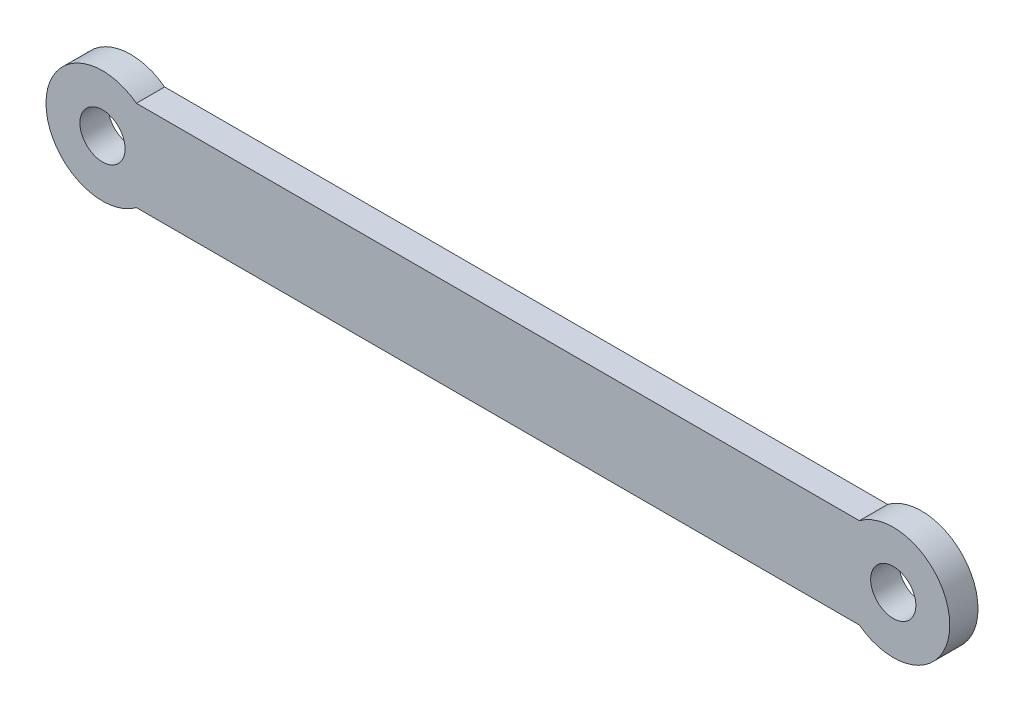
ISO-10303-21;
HEADER;
FILE_DESCRIPTION(('STEP AP214'),'2;1');
FILE_NAME('part.step','',(''),(''),'','','');
FILE_SCHEMA(('AUTOMOTIVE_DESIGN { 1 0 10303 214 1 1 1 1 }'));
ENDSEC;
DATA;
#1=APPLICATION_CONTEXT('core data for automotive mechanical design processes');
#2=APPLICATION_PROTOCOL_DEFINITION('international standard','automotive_design',2000,#1);
#3=PRODUCT_CONTEXT('',#1,'mechanical');
#4=PRODUCT('Part','Part','',(#3));
#5=PRODUCT_RELATED_PRODUCT_CATEGORY('part','',(#4));
#6=PRODUCT_DEFINITION_FORMATION('','',#4);
#7=PRODUCT_DEFINITION_CONTEXT('part definition',#1,'design');
#8=PRODUCT_DEFINITION('design','',#6,#7);
#9=PRODUCT_DEFINITION_SHAPE('','',#8);
#10=(LENGTH_UNIT() NAMED_UNIT(*) SI_UNIT(.MILLI.,.METRE.));
#11=(NAMED_UNIT(*) PLANE_ANGLE_UNIT() SI_UNIT($,.RADIAN.));
#12=(NAMED_UNIT(*) SI_UNIT($,.STERADIAN.) SOLID_ANGLE_UNIT());
#13=UNCERTAINTY_MEASURE_WITH_UNIT(LENGTH_MEASURE(1.E-05),#10,'distance_accuracy_value','');
#14=(GEOMETRIC_REPRESENTATION_CONTEXT(3) GLOBAL_UNCERTAINTY_ASSIGNED_CONTEXT((#13)) GLOBAL_UNIT_ASSIGNED_CONTEXT((#10,
#11,#12)) REPRESENTATION_CONTEXT('',''));
#15=CARTESIAN_POINT('',(0.,0.,0.));
#16=DIRECTION('',(0.,0.,1.));
#17=DIRECTION('',(1.,0.,0.));
#18=AXIS2_PLACEMENT_3D('',#15,#16,#17);
#19=CARTESIAN_POINT('',(0.,0.,5.));
#20=DIRECTION('',(0.,0.,1.));
#21=DIRECTION('',(1.,0.,0.));
#22=AXIS2_PLACEMENT_3D('',#19,#20,#21);
#23=PLANE('',#22);
#24=CARTESIAN_POINT('',(0.,0.,5.));
#25=DIRECTION('',(0.,0.,1.));
#26=DIRECTION('',(1.,0.,0.));
#27=AXIS2_PLACEMENT_3D('',#24,#25,#26);
#28=CIRCLE('',#27,4.);
#29=CARTESIAN_POINT('',(4.,0.,5.));
#30=VERTEX_POINT('',#29);
#31=EDGE_CURVE('E99',#30,#30,#28,.T.);
#32=ORIENTED_EDGE('',*,*,#31,.F.);
#33=EDGE_LOOP('',(#32));
#34=FACE_BOUND('',#33,.T.);
#35=CARTESIAN_POINT('',(0.,0.,5.));
#36=DIRECTION('',(0.,0.,1.));
#37=DIRECTION('',(1.,0.,0.));
#38=AXIS2_PLACEMENT_3D('',#35,#36,#37);
#39=CIRCLE('',#38,10.);
#40=CARTESIAN_POINT('',(6.,8.,5.));
#41=VERTEX_POINT('',#40);
#42=CARTESIAN_POINT('',(6.,-8.,5.));
#43=VERTEX_POINT('',#42);
#44=EDGE_CURVE('E84',#41,#43,#39,.T.);
#45=ORIENTED_EDGE('',*,*,#44,.T.);
#46=DIRECTION('',(1.,0.,0.));
#47=VECTOR('',#46,1.);
#48=CARTESIAN_POINT('',(6.,-8.,5.));
#49=LINE('',#48,#47);
#50=CARTESIAN_POINT('',(134.,-8.,5.));
#51=VERTEX_POINT('',#50);
#52=EDGE_CURVE('E79',#43,#51,#49,.T.);
#53=ORIENTED_EDGE('',*,*,#52,.T.);
#54=CARTESIAN_POINT('',(140.,0.,5.));
#55=DIRECTION('',(0.,0.,1.));
#56=DIRECTION('',(1.,0.,0.));
#57=AXIS2_PLACEMENT_3D('',#54,#55,#56);
#58=CIRCLE('',#57,10.);
#59=CARTESIAN_POINT('',(134.,8.,5.));
#60=VERTEX_POINT('',#59);
#61=EDGE_CURVE('E82',#51,#60,#58,.T.);
#62=ORIENTED_EDGE('',*,*,#61,.T.);
#63=DIRECTION('',(-1.,0.,0.));
#64=VECTOR('',#63,1.);
#65=CARTESIAN_POINT('',(6.,8.,5.));
#66=LINE('',#65,#64);
#67=EDGE_CURVE('E49',#60,#41,#66,.T.);
#68=ORIENTED_EDGE('',*,*,#67,.T.);
#69=EDGE_LOOP('',(#45,#53,#62,#68));
#70=FACE_BOUND('',#69,.T.);
#71=CARTESIAN_POINT('',(140.,0.,5.));
#72=DIRECTION('',(0.,0.,1.));
#73=DIRECTION('',(1.,0.,0.));
#74=AXIS2_PLACEMENT_3D('',#71,#72,#73);
#75=CIRCLE('',#74,3.99999999999999);
#76=CARTESIAN_POINT('',(144.,0.,5.));
#77=VERTEX_POINT('',#76);
#78=EDGE_CURVE('E114',#77,#77,#75,.T.);
#79=ORIENTED_EDGE('',*,*,#78,.F.);
#80=EDGE_LOOP('',(#79));
#81=FACE_BOUND('',#80,.T.);
#82=ADVANCED_FACE('F32',(#34,#70,#81),#23,.T.);
#83=CARTESIAN_POINT('',(0.,0.,0.));
#84=DIRECTION('',(0.,0.,1.));
#85=DIRECTION('',(1.,0.,0.));
#86=AXIS2_PLACEMENT_3D('',#83,#84,#85);
#87=PLANE('',#86);
#88=CARTESIAN_POINT('',(0.,0.,0.));
#89=DIRECTION('',(0.,0.,1.));
#90=DIRECTION('',(1.,0.,0.));
#91=AXIS2_PLACEMENT_3D('',#88,#89,#90);
#92=CIRCLE('',#91,4.);
#93=CARTESIAN_POINT('',(4.,0.,0.));
#94=VERTEX_POINT('',#93);
#95=EDGE_CURVE('E111',#94,#94,#92,.T.);
#96=ORIENTED_EDGE('',*,*,#95,.T.);
#97=EDGE_LOOP('',(#96));
#98=FACE_BOUND('',#97,.T.);
#99=CARTESIAN_POINT('',(0.,0.,0.));
#100=DIRECTION('',(0.,0.,1.));
#101=DIRECTION('',(1.,0.,0.));
#102=AXIS2_PLACEMENT_3D('',#99,#100,#101);
#103=CIRCLE('',#102,10.);
#104=CARTESIAN_POINT('',(6.,8.,0.));
#105=VERTEX_POINT('',#104);
#106=CARTESIAN_POINT('',(6.,-8.,0.));
#107=VERTEX_POINT('',#106);
#108=EDGE_CURVE('E96',#105,#107,#103,.T.);
#109=ORIENTED_EDGE('',*,*,#108,.F.);
#110=DIRECTION('',(-1.,0.,0.));
#111=VECTOR('',#110,1.);
#112=CARTESIAN_POINT('',(6.,8.,0.));
#113=LINE('',#112,#111);
#114=CARTESIAN_POINT('',(134.,8.,0.));
#115=VERTEX_POINT('',#114);
#116=EDGE_CURVE('E72',#115,#105,#113,.T.);
#117=ORIENTED_EDGE('',*,*,#116,.F.);
#118=CARTESIAN_POINT('',(140.,0.,0.));
#119=DIRECTION('',(0.,0.,1.));
#120=DIRECTION('',(1.,0.,0.));
#121=AXIS2_PLACEMENT_3D('',#118,#119,#120);
#122=CIRCLE('',#121,10.);
#123=CARTESIAN_POINT('',(134.,-8.,0.));
#124=VERTEX_POINT('',#123);
#125=EDGE_CURVE('E66',#124,#115,#122,.T.);
#126=ORIENTED_EDGE('',*,*,#125,.F.);
#127=DIRECTION('',(1.,0.,0.));
#128=VECTOR('',#127,1.);
#129=CARTESIAN_POINT('',(6.,-8.,0.));
#130=LINE('',#129,#128);
#131=EDGE_CURVE('E88',#107,#124,#130,.T.);
#132=ORIENTED_EDGE('',*,*,#131,.F.);
#133=EDGE_LOOP('',(#109,#117,#126,#132));
#134=FACE_BOUND('',#133,.T.);
#135=CARTESIAN_POINT('',(140.,0.,0.));
#136=DIRECTION('',(0.,0.,1.));
#137=DIRECTION('',(1.,0.,0.));
#138=AXIS2_PLACEMENT_3D('',#135,#136,#137);
#139=CIRCLE('',#138,3.99999999999999);
#140=CARTESIAN_POINT('',(144.,0.,0.));
#141=VERTEX_POINT('',#140);
#142=EDGE_CURVE('E117',#141,#141,#139,.T.);
#143=ORIENTED_EDGE('',*,*,#142,.T.);
#144=EDGE_LOOP('',(#143));
#145=FACE_BOUND('',#144,.T.);
#146=ADVANCED_FACE('F107',(#98,#134,#145),#87,.F.);
#147=CARTESIAN_POINT('',(0.,0.,5.));
#148=DIRECTION('',(0.,0.,-1.));
#149=DIRECTION('',(-1.,0.,0.));
#150=AXIS2_PLACEMENT_3D('',#147,#148,#149);
#151=CYLINDRICAL_SURFACE('',#150,10.);
#152=ORIENTED_EDGE('',*,*,#108,.T.);
#153=DIRECTION('',(0.,0.,-1.));
#154=VECTOR('',#153,1.);
#155=CARTESIAN_POINT('',(6.,-8.,5.));
#156=LINE('',#155,#154);
#157=EDGE_CURVE('E11',#43,#107,#156,.T.);
#158=ORIENTED_EDGE('',*,*,#157,.F.);
#159=ORIENTED_EDGE('',*,*,#44,.F.);
#160=DIRECTION('',(0.,0.,-1.));
#161=VECTOR('',#160,1.);
#162=CARTESIAN_POINT('',(6.,8.,5.));
#163=LINE('',#162,#161);
#164=EDGE_CURVE('E92',#41,#105,#163,.T.);
#165=ORIENTED_EDGE('',*,*,#164,.T.);
#166=EDGE_LOOP('',(#152,#158,#159,#165));
#167=FACE_BOUND('',#166,.T.);
#168=ADVANCED_FACE('F34',(#167),#151,.T.);
#169=CARTESIAN_POINT('',(6.,-8.,5.));
#170=DIRECTION('',(0.,1.,0.));
#171=DIRECTION('',(0.,0.,1.));
#172=AXIS2_PLACEMENT_3D('',#169,#170,#171);
#173=PLANE('',#172);
#174=ORIENTED_EDGE('',*,*,#131,.T.);
#175=DIRECTION('',(0.,0.,-1.));
#176=VECTOR('',#175,1.);
#177=CARTESIAN_POINT('',(134.,-8.,5.));
#178=LINE('',#177,#176);
#179=EDGE_CURVE('E41',#51,#124,#178,.T.);
#180=ORIENTED_EDGE('',*,*,#179,.F.);
#181=ORIENTED_EDGE('',*,*,#52,.F.);
#182=ORIENTED_EDGE('',*,*,#157,.T.);
#183=EDGE_LOOP('',(#174,#180,#181,#182));
#184=FACE_BOUND('',#183,.T.);
#185=ADVANCED_FACE('F87',(#184),#173,.F.);
#186=CARTESIAN_POINT('',(140.,0.,5.));
#187=DIRECTION('',(0.,0.,-1.));
#188=DIRECTION('',(-1.,0.,0.));
#189=AXIS2_PLACEMENT_3D('',#186,#187,#188);
#190=CYLINDRICAL_SURFACE('',#189,10.);
#191=ORIENTED_EDGE('',*,*,#125,.T.);
#192=DIRECTION('',(0.,0.,-1.));
#193=VECTOR('',#192,1.);
#194=CARTESIAN_POINT('',(134.,8.,5.));
#195=LINE('',#194,#193);
#196=EDGE_CURVE('E89',#60,#115,#195,.T.);
#197=ORIENTED_EDGE('',*,*,#196,.F.);
#198=ORIENTED_EDGE('',*,*,#61,.F.);
#199=ORIENTED_EDGE('',*,*,#179,.T.);
#200=EDGE_LOOP('',(#191,#197,#198,#199));
#201=FACE_BOUND('',#200,.T.);
#202=ADVANCED_FACE('F90',(#201),#190,.T.);
#203=CARTESIAN_POINT('',(6.,8.,5.));
#204=DIRECTION('',(0.,-1.,0.));
#205=DIRECTION('',(0.,0.,-1.));
#206=AXIS2_PLACEMENT_3D('',#203,#204,#205);
#207=PLANE('',#206);
#208=ORIENTED_EDGE('',*,*,#116,.T.);
#209=ORIENTED_EDGE('',*,*,#164,.F.);
#210=ORIENTED_EDGE('',*,*,#67,.F.);
#211=ORIENTED_EDGE('',*,*,#196,.T.);
#212=EDGE_LOOP('',(#208,#209,#210,#211));
#213=FACE_BOUND('',#212,.T.);
#214=ADVANCED_FACE('F104',(#213),#207,.F.);
#215=CARTESIAN_POINT('',(0.,0.,5.));
#216=DIRECTION('',(0.,0.,-1.));
#217=DIRECTION('',(-1.,0.,0.));
#218=AXIS2_PLACEMENT_3D('',#215,#216,#217);
#219=CYLINDRICAL_SURFACE('',#218,4.);
#220=ORIENTED_EDGE('',*,*,#31,.T.);
#221=EDGE_LOOP('',(#220));
#222=FACE_BOUND('',#221,.T.);
#223=ORIENTED_EDGE('',*,*,#95,.F.);
#224=EDGE_LOOP('',(#223));
#225=FACE_BOUND('',#224,.T.);
#226=ADVANCED_FACE('F135',(#222,#225),#219,.F.);
#227=CARTESIAN_POINT('',(140.,0.,5.));
#228=DIRECTION('',(0.,0.,-1.));
#229=DIRECTION('',(-1.,0.,0.));
#230=AXIS2_PLACEMENT_3D('',#227,#228,#229);
#231=CYLINDRICAL_SURFACE('',#230,3.99999999999999);
#232=ORIENTED_EDGE('',*,*,#78,.T.);
#233=EDGE_LOOP('',(#232));
#234=FACE_BOUND('',#233,.T.);
#235=ORIENTED_EDGE('',*,*,#142,.F.);
#236=EDGE_LOOP('',(#235));
#237=FACE_BOUND('',#236,.T.);
#238=ADVANCED_FACE('F123',(#234,#237),#231,.F.);
#239=CLOSED_SHELL('',(#82,#146,#168,#185,#202,#214,#226,#238));
#240=MANIFOLD_SOLID_BREP('B2',#239);
#241=ADVANCED_BREP_SHAPE_REPRESENTATION('',(#18,#240),#14);
#242=SHAPE_DEFINITION_REPRESENTATION(#9,#241);
ENDSEC;
END-ISO-10303-21;
